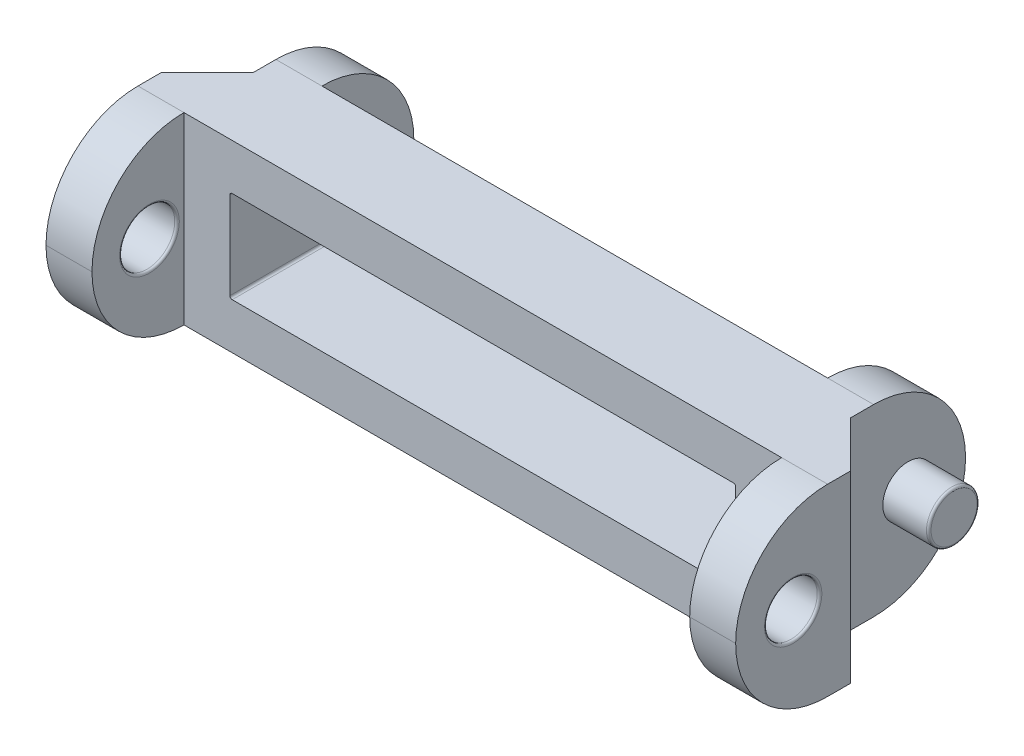
ISO-10303-21;
HEADER;
FILE_DESCRIPTION(('STEP AP214'),'2;1');
FILE_NAME('part.step','',(''),(''),'','','');
FILE_SCHEMA(('AUTOMOTIVE_DESIGN { 1 0 10303 214 1 1 1 1 }'));
ENDSEC;
DATA;
#1=APPLICATION_CONTEXT('core data for automotive mechanical design processes');
#2=APPLICATION_PROTOCOL_DEFINITION('international standard','automotive_design',2000,#1);
#3=PRODUCT_CONTEXT('',#1,'mechanical');
#4=PRODUCT('Part','Part','',(#3));
#5=PRODUCT_RELATED_PRODUCT_CATEGORY('part','',(#4));
#6=PRODUCT_DEFINITION_FORMATION('','',#4);
#7=PRODUCT_DEFINITION_CONTEXT('part definition',#1,'design');
#8=PRODUCT_DEFINITION('design','',#6,#7);
#9=PRODUCT_DEFINITION_SHAPE('','',#8);
#10=(LENGTH_UNIT() NAMED_UNIT(*) SI_UNIT(.MILLI.,.METRE.));
#11=(NAMED_UNIT(*) PLANE_ANGLE_UNIT() SI_UNIT($,.RADIAN.));
#12=(NAMED_UNIT(*) SI_UNIT($,.STERADIAN.) SOLID_ANGLE_UNIT());
#13=UNCERTAINTY_MEASURE_WITH_UNIT(LENGTH_MEASURE(1.E-05),#10,'distance_accuracy_value','');
#14=(GEOMETRIC_REPRESENTATION_CONTEXT(3) GLOBAL_UNCERTAINTY_ASSIGNED_CONTEXT((#13)) GLOBAL_UNIT_ASSIGNED_CONTEXT((#10,
#11,#12)) REPRESENTATION_CONTEXT('',''));
#15=CARTESIAN_POINT('',(0.,0.,0.));
#16=DIRECTION('',(0.,0.,1.));
#17=DIRECTION('',(1.,0.,0.));
#18=AXIS2_PLACEMENT_3D('',#15,#16,#17);
#19=CARTESIAN_POINT('',(0.,0.,-1.));
#20=DIRECTION('',(0.,0.,1.));
#21=DIRECTION('',(1.,0.,0.));
#22=AXIS2_PLACEMENT_3D('',#19,#20,#21);
#23=PLANE('',#22);
#24=DIRECTION('',(1.,0.,0.));
#25=VECTOR('',#24,1.);
#26=CARTESIAN_POINT('',(0.,-2.,-1.));
#27=LINE('',#26,#25);
#28=CARTESIAN_POINT('',(-5.5,-2.,-1.));
#29=VERTEX_POINT('',#28);
#30=CARTESIAN_POINT('',(5.5,-2.,-1.));
#31=VERTEX_POINT('',#30);
#32=EDGE_CURVE('E255',#29,#31,#27,.T.);
#33=ORIENTED_EDGE('',*,*,#32,.F.);
#34=DIRECTION('',(0.,1.,0.));
#35=VECTOR('',#34,1.);
#36=CARTESIAN_POINT('',(-5.5,2.,-1.));
#37=LINE('',#36,#35);
#38=CARTESIAN_POINT('',(-5.5,-0.95,-1.));
#39=VERTEX_POINT('',#38);
#40=EDGE_CURVE('E285',#29,#39,#37,.T.);
#41=ORIENTED_EDGE('',*,*,#40,.T.);
#42=CARTESIAN_POINT('',(-5.45,-0.95,-1.));
#43=DIRECTION('',(0.,0.,1.));
#44=DIRECTION('',(1.,0.,0.));
#45=AXIS2_PLACEMENT_3D('',#42,#43,#44);
#46=CIRCLE('',#45,0.05);
#47=CARTESIAN_POINT('',(-5.45,-1.,-1.));
#48=VERTEX_POINT('',#47);
#49=EDGE_CURVE('E74',#39,#48,#46,.T.);
#50=ORIENTED_EDGE('',*,*,#49,.T.);
#51=DIRECTION('',(1.,0.,0.));
#52=VECTOR('',#51,1.);
#53=CARTESIAN_POINT('',(-5.5,-1.,-1.));
#54=LINE('',#53,#52);
#55=CARTESIAN_POINT('',(5.45,-1.,-1.));
#56=VERTEX_POINT('',#55);
#57=EDGE_CURVE('E526',#48,#56,#54,.T.);
#58=ORIENTED_EDGE('',*,*,#57,.T.);
#59=CARTESIAN_POINT('',(5.45,-0.95,-1.));
#60=DIRECTION('',(0.,0.,1.));
#61=DIRECTION('',(1.,0.,0.));
#62=AXIS2_PLACEMENT_3D('',#59,#60,#61);
#63=CIRCLE('',#62,0.05);
#64=CARTESIAN_POINT('',(5.5,-0.95,-1.));
#65=VERTEX_POINT('',#64);
#66=EDGE_CURVE('E329',#56,#65,#63,.T.);
#67=ORIENTED_EDGE('',*,*,#66,.T.);
#68=DIRECTION('',(0.,-1.,0.));
#69=VECTOR('',#68,1.);
#70=CARTESIAN_POINT('',(5.5,2.,-1.));
#71=LINE('',#70,#69);
#72=EDGE_CURVE('E250',#65,#31,#71,.T.);
#73=ORIENTED_EDGE('',*,*,#72,.T.);
#74=EDGE_LOOP('',(#33,#41,#50,#58,#67,#73));
#75=FACE_BOUND('',#74,.T.);
#76=ADVANCED_FACE('F59',(#75),#23,.F.);
#77=CARTESIAN_POINT('',(6.5,0.,1.));
#78=DIRECTION('',(-1.,0.,0.));
#79=DIRECTION('',(0.,0.,1.));
#80=AXIS2_PLACEMENT_3D('',#77,#78,#79);
#81=PLANE('',#80);
#82=CARTESIAN_POINT('',(6.5,0.,-1.75));
#83=DIRECTION('',(-1.,0.,0.));
#84=DIRECTION('',(0.,0.,1.));
#85=AXIS2_PLACEMENT_3D('',#82,#83,#84);
#86=CIRCLE('',#85,0.55);
#87=CARTESIAN_POINT('',(6.5,0.,-1.2));
#88=VERTEX_POINT('',#87);
#89=EDGE_CURVE('E305',#88,#88,#86,.F.);
#90=ORIENTED_EDGE('',*,*,#89,.F.);
#91=EDGE_LOOP('',(#90));
#92=FACE_BOUND('',#91,.T.);
#93=DIRECTION('',(0.,0.,-1.));
#94=VECTOR('',#93,1.);
#95=CARTESIAN_POINT('',(6.5,-2.,1.));
#96=LINE('',#95,#94);
#97=CARTESIAN_POINT('',(6.5,-2.,-0.499999999999996));
#98=VERTEX_POINT('',#97);
#99=CARTESIAN_POINT('',(6.5,-2.,-1.));
#100=VERTEX_POINT('',#99);
#101=EDGE_CURVE('E544',#98,#100,#96,.T.);
#102=ORIENTED_EDGE('',*,*,#101,.T.);
#103=CARTESIAN_POINT('',(6.5,0.,-1.));
#104=DIRECTION('',(-1.,0.,0.));
#105=DIRECTION('',(0.,0.,1.));
#106=AXIS2_PLACEMENT_3D('',#103,#104,#105);
#107=CIRCLE('',#106,2.);
#108=CARTESIAN_POINT('',(6.5,0.,-3.));
#109=VERTEX_POINT('',#108);
#110=EDGE_CURVE('E261',#100,#109,#107,.F.);
#111=ORIENTED_EDGE('',*,*,#110,.T.);
#112=CARTESIAN_POINT('',(6.5,0.,-1.));
#113=DIRECTION('',(-1.,0.,0.));
#114=DIRECTION('',(0.,0.,1.));
#115=AXIS2_PLACEMENT_3D('',#112,#113,#114);
#116=CIRCLE('',#115,2.);
#117=CARTESIAN_POINT('',(6.5,2.,-1.));
#118=VERTEX_POINT('',#117);
#119=EDGE_CURVE('E264',#109,#118,#116,.F.);
#120=ORIENTED_EDGE('',*,*,#119,.T.);
#121=DIRECTION('',(0.,0.,-1.));
#122=VECTOR('',#121,1.);
#123=CARTESIAN_POINT('',(6.5,2.,1.));
#124=LINE('',#123,#122);
#125=CARTESIAN_POINT('',(6.5,2.,-0.499999999999995));
#126=VERTEX_POINT('',#125);
#127=EDGE_CURVE('E228',#126,#118,#124,.T.);
#128=ORIENTED_EDGE('',*,*,#127,.F.);
#129=DIRECTION('',(0.,-1.,0.));
#130=VECTOR('',#129,1.);
#131=CARTESIAN_POINT('',(6.5,-2.,-0.499999999999996));
#132=LINE('',#131,#130);
#133=EDGE_CURVE('E564',#126,#98,#132,.T.);
#134=ORIENTED_EDGE('',*,*,#133,.T.);
#135=EDGE_LOOP('',(#102,#111,#120,#128,#134));
#136=FACE_BOUND('',#135,.T.);
#137=ADVANCED_FACE('F391',(#92,#136),#81,.F.);
#138=CARTESIAN_POINT('',(0.,0.,1.));
#139=DIRECTION('',(0.,0.,1.));
#140=DIRECTION('',(1.,0.,0.));
#141=AXIS2_PLACEMENT_3D('',#138,#139,#140);
#142=PLANE('',#141);
#143=DIRECTION('',(0.,1.,0.));
#144=VECTOR('',#143,1.);
#145=CARTESIAN_POINT('',(6.5,0.,1.));
#146=LINE('',#145,#144);
#147=CARTESIAN_POINT('',(6.5,-2.,1.));
#148=VERTEX_POINT('',#147);
#149=CARTESIAN_POINT('',(6.5,2.,1.));
#150=VERTEX_POINT('',#149);
#151=EDGE_CURVE('E499',#148,#150,#146,.T.);
#152=ORIENTED_EDGE('',*,*,#151,.T.);
#153=DIRECTION('',(-1.,0.,0.));
#154=VECTOR('',#153,1.);
#155=CARTESIAN_POINT('',(0.,2.,1.));
#156=LINE('',#155,#154);
#157=CARTESIAN_POINT('',(-6.5,2.,1.));
#158=VERTEX_POINT('',#157);
#159=EDGE_CURVE('E536',#150,#158,#156,.T.);
#160=ORIENTED_EDGE('',*,*,#159,.T.);
#161=DIRECTION('',(0.,-1.,0.));
#162=VECTOR('',#161,1.);
#163=CARTESIAN_POINT('',(-6.5,0.,1.));
#164=LINE('',#163,#162);
#165=CARTESIAN_POINT('',(-6.5,-2.,1.));
#166=VERTEX_POINT('',#165);
#167=EDGE_CURVE('E539',#158,#166,#164,.T.);
#168=ORIENTED_EDGE('',*,*,#167,.T.);
#169=DIRECTION('',(1.,0.,0.));
#170=VECTOR('',#169,1.);
#171=CARTESIAN_POINT('',(0.,-2.,1.));
#172=LINE('',#171,#170);
#173=EDGE_CURVE('E542',#166,#148,#172,.T.);
#174=ORIENTED_EDGE('',*,*,#173,.T.);
#175=EDGE_LOOP('',(#152,#160,#168,#174));
#176=FACE_BOUND('',#175,.T.);
#177=DIRECTION('',(-1.,0.,0.));
#178=VECTOR('',#177,1.);
#179=CARTESIAN_POINT('',(-5.5,1.,1.));
#180=LINE('',#179,#178);
#181=CARTESIAN_POINT('',(5.45,1.,1.));
#182=VERTEX_POINT('',#181);
#183=CARTESIAN_POINT('',(-5.45,1.,1.));
#184=VERTEX_POINT('',#183);
#185=EDGE_CURVE('E525',#182,#184,#180,.T.);
#186=ORIENTED_EDGE('',*,*,#185,.F.);
#187=CARTESIAN_POINT('',(5.45,0.95,1.));
#188=DIRECTION('',(0.,0.,1.));
#189=DIRECTION('',(1.,0.,0.));
#190=AXIS2_PLACEMENT_3D('',#187,#188,#189);
#191=CIRCLE('',#190,0.05);
#192=CARTESIAN_POINT('',(5.5,0.95,1.));
#193=VERTEX_POINT('',#192);
#194=EDGE_CURVE('E327',#182,#193,#191,.F.);
#195=ORIENTED_EDGE('',*,*,#194,.T.);
#196=DIRECTION('',(0.,1.,0.));
#197=VECTOR('',#196,1.);
#198=CARTESIAN_POINT('',(5.5,-1.,1.));
#199=LINE('',#198,#197);
#200=CARTESIAN_POINT('',(5.5,-0.95,1.));
#201=VERTEX_POINT('',#200);
#202=EDGE_CURVE('E523',#201,#193,#199,.T.);
#203=ORIENTED_EDGE('',*,*,#202,.F.);
#204=CARTESIAN_POINT('',(5.45,-0.95,1.));
#205=DIRECTION('',(0.,0.,1.));
#206=DIRECTION('',(1.,0.,0.));
#207=AXIS2_PLACEMENT_3D('',#204,#205,#206);
#208=CIRCLE('',#207,0.05);
#209=CARTESIAN_POINT('',(5.45,-1.,1.));
#210=VERTEX_POINT('',#209);
#211=EDGE_CURVE('E332',#201,#210,#208,.F.);
#212=ORIENTED_EDGE('',*,*,#211,.T.);
#213=DIRECTION('',(1.,0.,0.));
#214=VECTOR('',#213,1.);
#215=CARTESIAN_POINT('',(-5.5,-1.,1.));
#216=LINE('',#215,#214);
#217=CARTESIAN_POINT('',(-5.45,-1.,1.));
#218=VERTEX_POINT('',#217);
#219=EDGE_CURVE('E256',#218,#210,#216,.T.);
#220=ORIENTED_EDGE('',*,*,#219,.F.);
#221=CARTESIAN_POINT('',(-5.45,-0.95,1.));
#222=DIRECTION('',(0.,0.,1.));
#223=DIRECTION('',(1.,0.,0.));
#224=AXIS2_PLACEMENT_3D('',#221,#222,#223);
#225=CIRCLE('',#224,0.05);
#226=CARTESIAN_POINT('',(-5.5,-0.95,1.));
#227=VERTEX_POINT('',#226);
#228=EDGE_CURVE('E349',#218,#227,#225,.F.);
#229=ORIENTED_EDGE('',*,*,#228,.T.);
#230=DIRECTION('',(0.,-1.,0.));
#231=VECTOR('',#230,1.);
#232=CARTESIAN_POINT('',(-5.5,-1.,1.));
#233=LINE('',#232,#231);
#234=CARTESIAN_POINT('',(-5.5,0.95,1.));
#235=VERTEX_POINT('',#234);
#236=EDGE_CURVE('E529',#235,#227,#233,.T.);
#237=ORIENTED_EDGE('',*,*,#236,.F.);
#238=CARTESIAN_POINT('',(-5.45,0.95,1.));
#239=DIRECTION('',(0.,0.,1.));
#240=DIRECTION('',(1.,0.,0.));
#241=AXIS2_PLACEMENT_3D('',#238,#239,#240);
#242=CIRCLE('',#241,0.05);
#243=EDGE_CURVE('E346',#235,#184,#242,.F.);
#244=ORIENTED_EDGE('',*,*,#243,.T.);
#245=EDGE_LOOP('',(#186,#195,#203,#212,#220,#229,#237,#244));
#246=FACE_BOUND('',#245,.T.);
#247=ADVANCED_FACE('F396',(#176,#246),#142,.T.);
#248=CARTESIAN_POINT('',(5.5,2.,-1.));
#249=VERTEX_POINT('',#248);
#250=CARTESIAN_POINT('',(5.5,0.95,-1.));
#251=VERTEX_POINT('',#250);
#252=EDGE_CURVE('E237',#249,#251,#71,.T.);
#253=ORIENTED_EDGE('',*,*,#252,.T.);
#254=CARTESIAN_POINT('',(5.45,0.95,-1.));
#255=DIRECTION('',(0.,0.,1.));
#256=DIRECTION('',(1.,0.,0.));
#257=AXIS2_PLACEMENT_3D('',#254,#255,#256);
#258=CIRCLE('',#257,0.05);
#259=CARTESIAN_POINT('',(5.45,1.,-1.));
#260=VERTEX_POINT('',#259);
#261=EDGE_CURVE('E325',#251,#260,#258,.T.);
#262=ORIENTED_EDGE('',*,*,#261,.T.);
#263=DIRECTION('',(-1.,0.,0.));
#264=VECTOR('',#263,1.);
#265=CARTESIAN_POINT('',(-5.5,1.,-1.));
#266=LINE('',#265,#264);
#267=CARTESIAN_POINT('',(-5.45,1.,-1.));
#268=VERTEX_POINT('',#267);
#269=EDGE_CURVE('E522',#260,#268,#266,.T.);
#270=ORIENTED_EDGE('',*,*,#269,.T.);
#271=CARTESIAN_POINT('',(-5.45,0.95,-1.));
#272=DIRECTION('',(0.,0.,1.));
#273=DIRECTION('',(1.,0.,0.));
#274=AXIS2_PLACEMENT_3D('',#271,#272,#273);
#275=CIRCLE('',#274,0.05);
#276=CARTESIAN_POINT('',(-5.5,0.95,-1.));
#277=VERTEX_POINT('',#276);
#278=EDGE_CURVE('E344',#268,#277,#275,.T.);
#279=ORIENTED_EDGE('',*,*,#278,.T.);
#280=CARTESIAN_POINT('',(-5.5,2.,-1.));
#281=VERTEX_POINT('',#280);
#282=EDGE_CURVE('E254',#277,#281,#37,.T.);
#283=ORIENTED_EDGE('',*,*,#282,.T.);
#284=DIRECTION('',(-1.,0.,0.));
#285=VECTOR('',#284,1.);
#286=CARTESIAN_POINT('',(0.,2.,-1.));
#287=LINE('',#286,#285);
#288=EDGE_CURVE('E225',#249,#281,#287,.T.);
#289=ORIENTED_EDGE('',*,*,#288,.F.);
#290=EDGE_LOOP('',(#253,#262,#270,#279,#283,#289));
#291=FACE_BOUND('',#290,.T.);
#292=ADVANCED_FACE('F252',(#291),#23,.F.);
#293=CARTESIAN_POINT('',(0.,2.,1.));
#294=DIRECTION('',(0.,-1.,0.));
#295=DIRECTION('',(0.,0.,-1.));
#296=AXIS2_PLACEMENT_3D('',#293,#294,#295);
#297=PLANE('',#296);
#298=ORIENTED_EDGE('',*,*,#288,.T.);
#299=DIRECTION('',(-1.,0.,0.));
#300=VECTOR('',#299,1.);
#301=CARTESIAN_POINT('',(-6.5,2.,-1.));
#302=LINE('',#301,#300);
#303=CARTESIAN_POINT('',(-6.5,2.,-1.));
#304=VERTEX_POINT('',#303);
#305=EDGE_CURVE('E303',#281,#304,#302,.T.);
#306=ORIENTED_EDGE('',*,*,#305,.T.);
#307=DIRECTION('',(0.,0.,-1.));
#308=VECTOR('',#307,1.);
#309=CARTESIAN_POINT('',(-6.5,2.,1.));
#310=LINE('',#309,#308);
#311=CARTESIAN_POINT('',(-6.5,2.,-0.500000000000002));
#312=VERTEX_POINT('',#311);
#313=EDGE_CURVE('E487',#312,#304,#310,.T.);
#314=ORIENTED_EDGE('',*,*,#313,.F.);
#315=DIRECTION('',(-0.707106781186545,0.,0.70710678118655));
#316=VECTOR('',#315,1.);
#317=CARTESIAN_POINT('',(-4.00000000000003,2.,-3.));
#318=LINE('',#317,#316);
#319=CARTESIAN_POINT('',(-7.5,2.,0.5));
#320=VERTEX_POINT('',#319);
#321=EDGE_CURVE('E288',#312,#320,#318,.T.);
#322=ORIENTED_EDGE('',*,*,#321,.T.);
#323=DIRECTION('',(0.,0.,1.));
#324=VECTOR('',#323,1.);
#325=CARTESIAN_POINT('',(-7.5,2.,0.5));
#326=LINE('',#325,#324);
#327=CARTESIAN_POINT('',(-7.5,2.,1.));
#328=VERTEX_POINT('',#327);
#329=EDGE_CURVE('E509',#320,#328,#326,.T.);
#330=ORIENTED_EDGE('',*,*,#329,.T.);
#331=DIRECTION('',(1.,0.,0.));
#332=VECTOR('',#331,1.);
#333=CARTESIAN_POINT('',(-6.5,2.,1.));
#334=LINE('',#333,#332);
#335=EDGE_CURVE('E280',#328,#158,#334,.T.);
#336=ORIENTED_EDGE('',*,*,#335,.T.);
#337=ORIENTED_EDGE('',*,*,#159,.F.);
#338=DIRECTION('',(-1.,0.,0.));
#339=VECTOR('',#338,1.);
#340=CARTESIAN_POINT('',(0.,2.,1.));
#341=LINE('',#340,#339);
#342=CARTESIAN_POINT('',(7.5,2.,1.));
#343=VERTEX_POINT('',#342);
#344=EDGE_CURVE('E562',#150,#343,#341,.F.);
#345=ORIENTED_EDGE('',*,*,#344,.T.);
#346=DIRECTION('',(0.,0.,1.));
#347=VECTOR('',#346,1.);
#348=CARTESIAN_POINT('',(7.5,2.,0.5));
#349=LINE('',#348,#347);
#350=CARTESIAN_POINT('',(7.5,2.,0.5));
#351=VERTEX_POINT('',#350);
#352=EDGE_CURVE('E516',#351,#343,#349,.T.);
#353=ORIENTED_EDGE('',*,*,#352,.F.);
#354=DIRECTION('',(0.707106781186549,0.,0.707106781186546));
#355=VECTOR('',#354,1.);
#356=CARTESIAN_POINT('',(3.99999999999998,2.,-3.));
#357=LINE('',#356,#355);
#358=EDGE_CURVE('E568',#351,#126,#357,.F.);
#359=ORIENTED_EDGE('',*,*,#358,.T.);
#360=ORIENTED_EDGE('',*,*,#127,.T.);
#361=DIRECTION('',(1.,0.,0.));
#362=VECTOR('',#361,1.);
#363=CARTESIAN_POINT('',(5.5,2.,-1.));
#364=LINE('',#363,#362);
#365=EDGE_CURVE('E221',#118,#249,#364,.F.);
#366=ORIENTED_EDGE('',*,*,#365,.T.);
#367=EDGE_LOOP('',(#298,#306,#314,#322,#330,#336,#337,#345,#353,#359,#360,#366));
#368=FACE_BOUND('',#367,.T.);
#369=ADVANCED_FACE('F223',(#368),#297,.F.);
#370=CARTESIAN_POINT('',(-6.5,0.,1.));
#371=DIRECTION('',(1.,0.,0.));
#372=DIRECTION('',(0.,0.,-1.));
#373=AXIS2_PLACEMENT_3D('',#370,#371,#372);
#374=PLANE('',#373);
#375=CARTESIAN_POINT('',(-6.5,0.,-1.75));
#376=DIRECTION('',(1.,0.,0.));
#377=DIRECTION('',(0.,0.,-1.));
#378=AXIS2_PLACEMENT_3D('',#375,#376,#377);
#379=CIRCLE('',#378,0.55);
#380=CARTESIAN_POINT('',(-6.5,0.,-2.3));
#381=VERTEX_POINT('',#380);
#382=EDGE_CURVE('E375',#381,#381,#379,.F.);
#383=ORIENTED_EDGE('',*,*,#382,.F.);
#384=EDGE_LOOP('',(#383));
#385=FACE_BOUND('',#384,.T.);
#386=CARTESIAN_POINT('',(-6.5,0.,-1.));
#387=DIRECTION('',(1.,0.,0.));
#388=DIRECTION('',(0.,0.,-1.));
#389=AXIS2_PLACEMENT_3D('',#386,#387,#388);
#390=CIRCLE('',#389,2.);
#391=CARTESIAN_POINT('',(-6.5,0.,-3.));
#392=VERTEX_POINT('',#391);
#393=EDGE_CURVE('E292',#304,#392,#390,.F.);
#394=ORIENTED_EDGE('',*,*,#393,.T.);
#395=CARTESIAN_POINT('',(-6.5,0.,-1.));
#396=DIRECTION('',(1.,0.,0.));
#397=DIRECTION('',(0.,0.,-1.));
#398=AXIS2_PLACEMENT_3D('',#395,#396,#397);
#399=CIRCLE('',#398,2.);
#400=CARTESIAN_POINT('',(-6.5,-2.,-1.));
#401=VERTEX_POINT('',#400);
#402=EDGE_CURVE('E294',#392,#401,#399,.F.);
#403=ORIENTED_EDGE('',*,*,#402,.T.);
#404=DIRECTION('',(0.,0.,-1.));
#405=VECTOR('',#404,1.);
#406=CARTESIAN_POINT('',(-6.5,-2.,1.));
#407=LINE('',#406,#405);
#408=CARTESIAN_POINT('',(-6.5,-2.,-0.500000000000003));
#409=VERTEX_POINT('',#408);
#410=EDGE_CURVE('E495',#409,#401,#407,.T.);
#411=ORIENTED_EDGE('',*,*,#410,.F.);
#412=DIRECTION('',(0.,1.,0.));
#413=VECTOR('',#412,1.);
#414=CARTESIAN_POINT('',(-6.5,0.,-0.500000000000003));
#415=LINE('',#414,#413);
#416=EDGE_CURVE('E282',#409,#312,#415,.T.);
#417=ORIENTED_EDGE('',*,*,#416,.T.);
#418=ORIENTED_EDGE('',*,*,#313,.T.);
#419=EDGE_LOOP('',(#394,#403,#411,#417,#418));
#420=FACE_BOUND('',#419,.T.);
#421=ADVANCED_FACE('F407',(#385,#420),#374,.F.);
#422=CARTESIAN_POINT('',(0.,-2.,1.));
#423=DIRECTION('',(0.,1.,0.));
#424=DIRECTION('',(0.,0.,1.));
#425=AXIS2_PLACEMENT_3D('',#422,#423,#424);
#426=PLANE('',#425);
#427=ORIENTED_EDGE('',*,*,#410,.T.);
#428=DIRECTION('',(-1.,0.,0.));
#429=VECTOR('',#428,1.);
#430=CARTESIAN_POINT('',(-5.5,-2.,-1.));
#431=LINE('',#430,#429);
#432=EDGE_CURVE('E296',#401,#29,#431,.F.);
#433=ORIENTED_EDGE('',*,*,#432,.T.);
#434=ORIENTED_EDGE('',*,*,#32,.T.);
#435=DIRECTION('',(1.,0.,0.));
#436=VECTOR('',#435,1.);
#437=CARTESIAN_POINT('',(6.5,-2.,-1.));
#438=LINE('',#437,#436);
#439=EDGE_CURVE('E572',#31,#100,#438,.T.);
#440=ORIENTED_EDGE('',*,*,#439,.T.);
#441=ORIENTED_EDGE('',*,*,#101,.F.);
#442=DIRECTION('',(-0.707106781186549,0.,-0.707106781186546));
#443=VECTOR('',#442,1.);
#444=CARTESIAN_POINT('',(3.99999999999998,-2.,-3.));
#445=LINE('',#444,#443);
#446=CARTESIAN_POINT('',(7.5,-2.,0.5));
#447=VERTEX_POINT('',#446);
#448=EDGE_CURVE('E570',#98,#447,#445,.F.);
#449=ORIENTED_EDGE('',*,*,#448,.T.);
#450=DIRECTION('',(0.,0.,-1.));
#451=VECTOR('',#450,1.);
#452=CARTESIAN_POINT('',(7.5,-2.,0.5));
#453=LINE('',#452,#451);
#454=CARTESIAN_POINT('',(7.5,-2.,1.));
#455=VERTEX_POINT('',#454);
#456=EDGE_CURVE('E519',#455,#447,#453,.T.);
#457=ORIENTED_EDGE('',*,*,#456,.F.);
#458=DIRECTION('',(-1.,0.,0.));
#459=VECTOR('',#458,1.);
#460=CARTESIAN_POINT('',(0.,-2.,1.));
#461=LINE('',#460,#459);
#462=EDGE_CURVE('E551',#455,#148,#461,.T.);
#463=ORIENTED_EDGE('',*,*,#462,.T.);
#464=ORIENTED_EDGE('',*,*,#173,.F.);
#465=DIRECTION('',(1.,0.,0.));
#466=VECTOR('',#465,1.);
#467=CARTESIAN_POINT('',(-7.5,-2.,1.));
#468=LINE('',#467,#466);
#469=CARTESIAN_POINT('',(-7.5,-2.,1.));
#470=VERTEX_POINT('',#469);
#471=EDGE_CURVE('E273',#166,#470,#468,.F.);
#472=ORIENTED_EDGE('',*,*,#471,.T.);
#473=DIRECTION('',(0.,0.,-1.));
#474=VECTOR('',#473,1.);
#475=CARTESIAN_POINT('',(-7.5,-2.,0.5));
#476=LINE('',#475,#474);
#477=CARTESIAN_POINT('',(-7.5,-2.,0.5));
#478=VERTEX_POINT('',#477);
#479=EDGE_CURVE('E507',#470,#478,#476,.T.);
#480=ORIENTED_EDGE('',*,*,#479,.T.);
#481=DIRECTION('',(0.707106781186545,0.,-0.70710678118655));
#482=VECTOR('',#481,1.);
#483=CARTESIAN_POINT('',(-4.00000000000003,-2.,-3.));
#484=LINE('',#483,#482);
#485=EDGE_CURVE('E290',#478,#409,#484,.T.);
#486=ORIENTED_EDGE('',*,*,#485,.T.);
#487=EDGE_LOOP('',(#427,#433,#434,#440,#441,#449,#457,#463,#464,#472,#480,#486));
#488=FACE_BOUND('',#487,.T.);
#489=ADVANCED_FACE('F418',(#488),#426,.F.);
#490=CARTESIAN_POINT('',(5.5,-1.,1.));
#491=DIRECTION('',(-1.,0.,0.));
#492=DIRECTION('',(0.,0.,1.));
#493=AXIS2_PLACEMENT_3D('',#490,#491,#492);
#494=PLANE('',#493);
#495=ORIENTED_EDGE('',*,*,#202,.T.);
#496=DIRECTION('',(0.,0.,-1.));
#497=VECTOR('',#496,1.);
#498=CARTESIAN_POINT('',(5.5,0.95,-1.));
#499=LINE('',#498,#497);
#500=EDGE_CURVE('E244',#193,#251,#499,.T.);
#501=ORIENTED_EDGE('',*,*,#500,.T.);
#502=ORIENTED_EDGE('',*,*,#252,.F.);
#503=CARTESIAN_POINT('',(5.5,0.,-1.));
#504=DIRECTION('',(-1.,0.,0.));
#505=DIRECTION('',(0.,0.,1.));
#506=AXIS2_PLACEMENT_3D('',#503,#504,#505);
#507=CIRCLE('',#506,2.);
#508=CARTESIAN_POINT('',(5.5,0.,-3.));
#509=VERTEX_POINT('',#508);
#510=EDGE_CURVE('E241',#249,#509,#507,.T.);
#511=ORIENTED_EDGE('',*,*,#510,.T.);
#512=CARTESIAN_POINT('',(5.5,0.,-1.));
#513=DIRECTION('',(-1.,0.,0.));
#514=DIRECTION('',(0.,0.,1.));
#515=AXIS2_PLACEMENT_3D('',#512,#513,#514);
#516=CIRCLE('',#515,2.);
#517=EDGE_CURVE('E233',#509,#31,#516,.T.);
#518=ORIENTED_EDGE('',*,*,#517,.T.);
#519=ORIENTED_EDGE('',*,*,#72,.F.);
#520=DIRECTION('',(0.,0.,-1.));
#521=VECTOR('',#520,1.);
#522=CARTESIAN_POINT('',(5.5,-0.95,1.));
#523=LINE('',#522,#521);
#524=EDGE_CURVE('E317',#65,#201,#523,.F.);
#525=ORIENTED_EDGE('',*,*,#524,.T.);
#526=EDGE_LOOP('',(#495,#501,#502,#511,#518,#519,#525));
#527=FACE_BOUND('',#526,.T.);
#528=ADVANCED_FACE('F239',(#527),#494,.T.);
#529=CARTESIAN_POINT('',(-5.5,1.,1.));
#530=DIRECTION('',(0.,-1.,0.));
#531=DIRECTION('',(0.,0.,-1.));
#532=AXIS2_PLACEMENT_3D('',#529,#530,#531);
#533=PLANE('',#532);
#534=ORIENTED_EDGE('',*,*,#185,.T.);
#535=DIRECTION('',(0.,0.,-1.));
#536=VECTOR('',#535,1.);
#537=CARTESIAN_POINT('',(-5.45,1.,-1.));
#538=LINE('',#537,#536);
#539=EDGE_CURVE('E335',#184,#268,#538,.T.);
#540=ORIENTED_EDGE('',*,*,#539,.T.);
#541=ORIENTED_EDGE('',*,*,#269,.F.);
#542=DIRECTION('',(0.,0.,-1.));
#543=VECTOR('',#542,1.);
#544=CARTESIAN_POINT('',(5.45,1.,1.));
#545=LINE('',#544,#543);
#546=EDGE_CURVE('E320',#260,#182,#545,.F.);
#547=ORIENTED_EDGE('',*,*,#546,.T.);
#548=EDGE_LOOP('',(#534,#540,#541,#547));
#549=FACE_BOUND('',#548,.T.);
#550=ADVANCED_FACE('F417',(#549),#533,.T.);
#551=CARTESIAN_POINT('',(-5.5,-1.,1.));
#552=DIRECTION('',(1.,0.,0.));
#553=DIRECTION('',(0.,0.,-1.));
#554=AXIS2_PLACEMENT_3D('',#551,#552,#553);
#555=PLANE('',#554);
#556=ORIENTED_EDGE('',*,*,#282,.F.);
#557=DIRECTION('',(0.,0.,-1.));
#558=VECTOR('',#557,1.);
#559=CARTESIAN_POINT('',(-5.5,0.95,1.));
#560=LINE('',#559,#558);
#561=EDGE_CURVE('E341',#277,#235,#560,.F.);
#562=ORIENTED_EDGE('',*,*,#561,.T.);
#563=ORIENTED_EDGE('',*,*,#236,.T.);
#564=DIRECTION('',(0.,0.,-1.));
#565=VECTOR('',#564,1.);
#566=CARTESIAN_POINT('',(-5.5,-0.95,-1.));
#567=LINE('',#566,#565);
#568=EDGE_CURVE('E338',#227,#39,#567,.T.);
#569=ORIENTED_EDGE('',*,*,#568,.T.);
#570=ORIENTED_EDGE('',*,*,#40,.F.);
#571=CARTESIAN_POINT('',(-5.5,0.,-1.));
#572=DIRECTION('',(1.,0.,0.));
#573=DIRECTION('',(0.,0.,-1.));
#574=AXIS2_PLACEMENT_3D('',#571,#572,#573);
#575=CIRCLE('',#574,2.);
#576=CARTESIAN_POINT('',(-5.5,0.,-3.));
#577=VERTEX_POINT('',#576);
#578=EDGE_CURVE('E301',#29,#577,#575,.T.);
#579=ORIENTED_EDGE('',*,*,#578,.T.);
#580=CARTESIAN_POINT('',(-5.5,0.,-1.));
#581=DIRECTION('',(1.,0.,0.));
#582=DIRECTION('',(0.,0.,-1.));
#583=AXIS2_PLACEMENT_3D('',#580,#581,#582);
#584=CIRCLE('',#583,2.);
#585=EDGE_CURVE('E299',#577,#281,#584,.T.);
#586=ORIENTED_EDGE('',*,*,#585,.T.);
#587=EDGE_LOOP('',(#556,#562,#563,#569,#570,#579,#586));
#588=FACE_BOUND('',#587,.T.);
#589=ADVANCED_FACE('F421',(#588),#555,.T.);
#590=CARTESIAN_POINT('',(-5.5,-1.,1.));
#591=DIRECTION('',(0.,1.,0.));
#592=DIRECTION('',(0.,0.,1.));
#593=AXIS2_PLACEMENT_3D('',#590,#591,#592);
#594=PLANE('',#593);
#595=ORIENTED_EDGE('',*,*,#57,.F.);
#596=DIRECTION('',(0.,0.,-1.));
#597=VECTOR('',#596,1.);
#598=CARTESIAN_POINT('',(-5.45,-1.,1.));
#599=LINE('',#598,#597);
#600=EDGE_CURVE('E81',#48,#218,#599,.F.);
#601=ORIENTED_EDGE('',*,*,#600,.T.);
#602=ORIENTED_EDGE('',*,*,#219,.T.);
#603=DIRECTION('',(0.,0.,-1.));
#604=VECTOR('',#603,1.);
#605=CARTESIAN_POINT('',(5.45,-1.,-1.));
#606=LINE('',#605,#604);
#607=EDGE_CURVE('E322',#210,#56,#606,.T.);
#608=ORIENTED_EDGE('',*,*,#607,.T.);
#609=EDGE_LOOP('',(#595,#601,#602,#608));
#610=FACE_BOUND('',#609,.T.);
#611=ADVANCED_FACE('F425',(#610),#594,.T.);
#612=CARTESIAN_POINT('',(6.5,0.,0.));
#613=DIRECTION('',(-1.,0.,0.));
#614=DIRECTION('',(0.,0.,1.));
#615=AXIS2_PLACEMENT_3D('',#612,#613,#614);
#616=PLANE('',#615);
#617=CARTESIAN_POINT('',(6.5,0.,1.75));
#618=DIRECTION('',(-1.,0.,0.));
#619=DIRECTION('',(0.,0.,1.));
#620=AXIS2_PLACEMENT_3D('',#617,#618,#619);
#621=CIRCLE('',#620,0.623833464467269);
#622=CARTESIAN_POINT('',(6.5,0.,2.37383346446727));
#623=VERTEX_POINT('',#622);
#624=EDGE_CURVE('E351',#623,#623,#621,.F.);
#625=ORIENTED_EDGE('',*,*,#624,.T.);
#626=EDGE_LOOP('',(#625));
#627=FACE_BOUND('',#626,.T.);
#628=ORIENTED_EDGE('',*,*,#151,.F.);
#629=CARTESIAN_POINT('',(6.5,0.,1.));
#630=DIRECTION('',(-1.,0.,0.));
#631=DIRECTION('',(0.,0.,1.));
#632=AXIS2_PLACEMENT_3D('',#629,#630,#631);
#633=CIRCLE('',#632,2.);
#634=CARTESIAN_POINT('',(6.5,0.,3.));
#635=VERTEX_POINT('',#634);
#636=EDGE_CURVE('E556',#148,#635,#633,.T.);
#637=ORIENTED_EDGE('',*,*,#636,.T.);
#638=CARTESIAN_POINT('',(6.5,0.,1.));
#639=DIRECTION('',(-1.,0.,0.));
#640=DIRECTION('',(0.,0.,1.));
#641=AXIS2_PLACEMENT_3D('',#638,#639,#640);
#642=CIRCLE('',#641,2.);
#643=EDGE_CURVE('E554',#635,#150,#642,.T.);
#644=ORIENTED_EDGE('',*,*,#643,.T.);
#645=EDGE_LOOP('',(#628,#637,#644));
#646=FACE_BOUND('',#645,.T.);
#647=ADVANCED_FACE('F429',(#627,#646),#616,.T.);
#648=CARTESIAN_POINT('',(7.5,0.,0.));
#649=DIRECTION('',(-1.,0.,0.));
#650=DIRECTION('',(0.,0.,1.));
#651=AXIS2_PLACEMENT_3D('',#648,#649,#650);
#652=PLANE('',#651);
#653=CARTESIAN_POINT('',(7.5,0.,1.75));
#654=DIRECTION('',(-1.,0.,0.));
#655=DIRECTION('',(0.,0.,1.));
#656=AXIS2_PLACEMENT_3D('',#653,#654,#655);
#657=CIRCLE('',#656,0.623833464467269);
#658=CARTESIAN_POINT('',(7.5,0.,2.37383346446727));
#659=VERTEX_POINT('',#658);
#660=EDGE_CURVE('E360',#659,#659,#657,.T.);
#661=ORIENTED_EDGE('',*,*,#660,.T.);
#662=EDGE_LOOP('',(#661));
#663=FACE_BOUND('',#662,.T.);
#664=CARTESIAN_POINT('',(7.5,0.,1.));
#665=DIRECTION('',(-1.,0.,0.));
#666=DIRECTION('',(0.,0.,1.));
#667=AXIS2_PLACEMENT_3D('',#664,#665,#666);
#668=CIRCLE('',#667,2.);
#669=CARTESIAN_POINT('',(7.5,0.,3.));
#670=VERTEX_POINT('',#669);
#671=EDGE_CURVE('E558',#343,#670,#668,.F.);
#672=ORIENTED_EDGE('',*,*,#671,.T.);
#673=CARTESIAN_POINT('',(7.5,0.,1.));
#674=DIRECTION('',(-1.,0.,0.));
#675=DIRECTION('',(0.,0.,1.));
#676=AXIS2_PLACEMENT_3D('',#673,#674,#675);
#677=CIRCLE('',#676,2.);
#678=EDGE_CURVE('E560',#670,#455,#677,.F.);
#679=ORIENTED_EDGE('',*,*,#678,.T.);
#680=ORIENTED_EDGE('',*,*,#456,.T.);
#681=DIRECTION('',(0.,1.,0.));
#682=VECTOR('',#681,1.);
#683=CARTESIAN_POINT('',(7.5,2.,0.5));
#684=LINE('',#683,#682);
#685=EDGE_CURVE('E513',#447,#351,#684,.T.);
#686=ORIENTED_EDGE('',*,*,#685,.T.);
#687=ORIENTED_EDGE('',*,*,#352,.T.);
#688=EDGE_LOOP('',(#672,#679,#680,#686,#687));
#689=FACE_BOUND('',#688,.T.);
#690=ADVANCED_FACE('F432',(#663,#689),#652,.F.);
#691=CARTESIAN_POINT('',(7.5,0.,1.));
#692=DIRECTION('',(-1.,0.,0.));
#693=DIRECTION('',(0.,0.,1.));
#694=AXIS2_PLACEMENT_3D('',#691,#692,#693);
#695=CYLINDRICAL_SURFACE('',#694,2.);
#696=DIRECTION('',(-1.,0.,0.));
#697=VECTOR('',#696,1.);
#698=CARTESIAN_POINT('',(7.5,0.,3.));
#699=LINE('',#698,#697);
#700=EDGE_CURVE('E512',#670,#635,#699,.T.);
#701=ORIENTED_EDGE('',*,*,#700,.F.);
#702=ORIENTED_EDGE('',*,*,#671,.F.);
#703=ORIENTED_EDGE('',*,*,#344,.F.);
#704=ORIENTED_EDGE('',*,*,#643,.F.);
#705=EDGE_LOOP('',(#701,#702,#703,#704));
#706=FACE_BOUND('',#705,.T.);
#707=ADVANCED_FACE('F436',(#706),#695,.T.);
#708=CARTESIAN_POINT('',(0.,0.,1.));
#709=DIRECTION('',(-1.,0.,0.));
#710=DIRECTION('',(0.,0.,1.));
#711=AXIS2_PLACEMENT_3D('',#708,#709,#710);
#712=CYLINDRICAL_SURFACE('',#711,2.);
#713=ORIENTED_EDGE('',*,*,#678,.F.);
#714=ORIENTED_EDGE('',*,*,#700,.T.);
#715=ORIENTED_EDGE('',*,*,#636,.F.);
#716=ORIENTED_EDGE('',*,*,#462,.F.);
#717=EDGE_LOOP('',(#713,#714,#715,#716));
#718=FACE_BOUND('',#717,.T.);
#719=ADVANCED_FACE('F660',(#718),#712,.T.);
#720=CARTESIAN_POINT('',(7.5,2.,0.5));
#721=DIRECTION('',(0.707106781186546,0.,-0.707106781186549));
#722=DIRECTION('',(0.,-1.,0.));
#723=AXIS2_PLACEMENT_3D('',#720,#721,#722);
#724=PLANE('',#723);
#725=ORIENTED_EDGE('',*,*,#448,.F.);
#726=ORIENTED_EDGE('',*,*,#133,.F.);
#727=ORIENTED_EDGE('',*,*,#358,.F.);
#728=ORIENTED_EDGE('',*,*,#685,.F.);
#729=EDGE_LOOP('',(#725,#726,#727,#728));
#730=FACE_BOUND('',#729,.T.);
#731=ADVANCED_FACE('F442',(#730),#724,.T.);
#732=CARTESIAN_POINT('',(-6.5,0.,0.));
#733=DIRECTION('',(1.,0.,0.));
#734=DIRECTION('',(0.,0.,1.));
#735=AXIS2_PLACEMENT_3D('',#732,#733,#734);
#736=PLANE('',#735);
#737=CARTESIAN_POINT('',(-6.5,0.,1.75));
#738=DIRECTION('',(1.,0.,0.));
#739=DIRECTION('',(0.,0.,-1.));
#740=AXIS2_PLACEMENT_3D('',#737,#738,#739);
#741=CIRCLE('',#740,0.65);
#742=CARTESIAN_POINT('',(-6.5,0.,1.1));
#743=VERTEX_POINT('',#742);
#744=EDGE_CURVE('E363',#743,#743,#741,.F.);
#745=ORIENTED_EDGE('',*,*,#744,.T.);
#746=EDGE_LOOP('',(#745));
#747=FACE_BOUND('',#746,.T.);
#748=CARTESIAN_POINT('',(-6.5,0.,1.));
#749=DIRECTION('',(1.,0.,0.));
#750=DIRECTION('',(0.,0.,-1.));
#751=AXIS2_PLACEMENT_3D('',#748,#749,#750);
#752=CIRCLE('',#751,2.);
#753=CARTESIAN_POINT('',(-6.5,0.,3.));
#754=VERTEX_POINT('',#753);
#755=EDGE_CURVE('E232',#158,#754,#752,.T.);
#756=ORIENTED_EDGE('',*,*,#755,.T.);
#757=CARTESIAN_POINT('',(-6.5,0.,1.));
#758=DIRECTION('',(1.,0.,0.));
#759=DIRECTION('',(0.,0.,-1.));
#760=AXIS2_PLACEMENT_3D('',#757,#758,#759);
#761=CIRCLE('',#760,2.);
#762=EDGE_CURVE('E271',#754,#166,#761,.T.);
#763=ORIENTED_EDGE('',*,*,#762,.T.);
#764=ORIENTED_EDGE('',*,*,#167,.F.);
#765=EDGE_LOOP('',(#756,#763,#764));
#766=FACE_BOUND('',#765,.T.);
#767=ADVANCED_FACE('F438',(#747,#766),#736,.T.);
#768=CARTESIAN_POINT('',(-7.5,0.,0.));
#769=DIRECTION('',(1.,0.,0.));
#770=DIRECTION('',(0.,0.,1.));
#771=AXIS2_PLACEMENT_3D('',#768,#769,#770);
#772=PLANE('',#771);
#773=CARTESIAN_POINT('',(-7.5,0.,1.75));
#774=DIRECTION('',(1.,0.,0.));
#775=DIRECTION('',(0.,0.,-1.));
#776=AXIS2_PLACEMENT_3D('',#773,#774,#775);
#777=CIRCLE('',#776,0.65);
#778=CARTESIAN_POINT('',(-7.5,0.,1.1));
#779=VERTEX_POINT('',#778);
#780=EDGE_CURVE('E372',#779,#779,#777,.T.);
#781=ORIENTED_EDGE('',*,*,#780,.T.);
#782=EDGE_LOOP('',(#781));
#783=FACE_BOUND('',#782,.T.);
#784=ORIENTED_EDGE('',*,*,#479,.F.);
#785=CARTESIAN_POINT('',(-7.5,0.,1.));
#786=DIRECTION('',(1.,0.,0.));
#787=DIRECTION('',(0.,0.,-1.));
#788=AXIS2_PLACEMENT_3D('',#785,#786,#787);
#789=CIRCLE('',#788,2.);
#790=CARTESIAN_POINT('',(-7.5,0.,3.));
#791=VERTEX_POINT('',#790);
#792=EDGE_CURVE('E278',#470,#791,#789,.F.);
#793=ORIENTED_EDGE('',*,*,#792,.T.);
#794=CARTESIAN_POINT('',(-7.5,0.,1.));
#795=DIRECTION('',(1.,0.,0.));
#796=DIRECTION('',(0.,0.,-1.));
#797=AXIS2_PLACEMENT_3D('',#794,#795,#796);
#798=CIRCLE('',#797,2.);
#799=EDGE_CURVE('E276',#791,#328,#798,.F.);
#800=ORIENTED_EDGE('',*,*,#799,.T.);
#801=ORIENTED_EDGE('',*,*,#329,.F.);
#802=DIRECTION('',(0.,1.,0.));
#803=VECTOR('',#802,1.);
#804=CARTESIAN_POINT('',(-7.5,2.,0.5));
#805=LINE('',#804,#803);
#806=EDGE_CURVE('E247',#478,#320,#805,.T.);
#807=ORIENTED_EDGE('',*,*,#806,.F.);
#808=EDGE_LOOP('',(#784,#793,#800,#801,#807));
#809=FACE_BOUND('',#808,.T.);
#810=ADVANCED_FACE('F441',(#783,#809),#772,.F.);
#811=CARTESIAN_POINT('',(1.02786404500042,0.,-1.));
#812=DIRECTION('',(-1.,0.,0.));
#813=DIRECTION('',(0.,0.,1.));
#814=AXIS2_PLACEMENT_3D('',#811,#812,#813);
#815=CYLINDRICAL_SURFACE('',#814,2.);
#816=DIRECTION('',(1.,0.,0.));
#817=VECTOR('',#816,1.);
#818=CARTESIAN_POINT('',(6.5,0.,-3.));
#819=LINE('',#818,#817);
#820=EDGE_CURVE('E248',#509,#109,#819,.T.);
#821=ORIENTED_EDGE('',*,*,#820,.F.);
#822=ORIENTED_EDGE('',*,*,#510,.F.);
#823=ORIENTED_EDGE('',*,*,#365,.F.);
#824=ORIENTED_EDGE('',*,*,#119,.F.);
#825=EDGE_LOOP('',(#821,#822,#823,#824));
#826=FACE_BOUND('',#825,.T.);
#827=ADVANCED_FACE('F258',(#826),#815,.T.);
#828=CARTESIAN_POINT('',(0.,0.,-1.));
#829=DIRECTION('',(-1.,0.,0.));
#830=DIRECTION('',(0.,0.,1.));
#831=AXIS2_PLACEMENT_3D('',#828,#829,#830);
#832=CYLINDRICAL_SURFACE('',#831,2.);
#833=ORIENTED_EDGE('',*,*,#517,.F.);
#834=ORIENTED_EDGE('',*,*,#820,.T.);
#835=ORIENTED_EDGE('',*,*,#110,.F.);
#836=ORIENTED_EDGE('',*,*,#439,.F.);
#837=EDGE_LOOP('',(#833,#834,#835,#836));
#838=FACE_BOUND('',#837,.T.);
#839=ADVANCED_FACE('F576',(#838),#832,.T.);
#840=CARTESIAN_POINT('',(0.,0.,1.));
#841=DIRECTION('',(-1.,0.,0.));
#842=DIRECTION('',(0.,0.,1.));
#843=AXIS2_PLACEMENT_3D('',#840,#841,#842);
#844=CYLINDRICAL_SURFACE('',#843,2.);
#845=ORIENTED_EDGE('',*,*,#335,.F.);
#846=ORIENTED_EDGE('',*,*,#799,.F.);
#847=DIRECTION('',(1.,0.,0.));
#848=VECTOR('',#847,1.);
#849=CARTESIAN_POINT('',(-7.5,0.,3.));
#850=LINE('',#849,#848);
#851=EDGE_CURVE('E269',#754,#791,#850,.F.);
#852=ORIENTED_EDGE('',*,*,#851,.F.);
#853=ORIENTED_EDGE('',*,*,#755,.F.);
#854=EDGE_LOOP('',(#845,#846,#852,#853));
#855=FACE_BOUND('',#854,.T.);
#856=ADVANCED_FACE('F629',(#855),#844,.T.);
#857=CARTESIAN_POINT('',(-7.5,0.,1.));
#858=DIRECTION('',(-1.,0.,0.));
#859=DIRECTION('',(0.,0.,1.));
#860=AXIS2_PLACEMENT_3D('',#857,#858,#859);
#861=CYLINDRICAL_SURFACE('',#860,2.);
#862=ORIENTED_EDGE('',*,*,#792,.F.);
#863=ORIENTED_EDGE('',*,*,#471,.F.);
#864=ORIENTED_EDGE('',*,*,#762,.F.);
#865=ORIENTED_EDGE('',*,*,#851,.T.);
#866=EDGE_LOOP('',(#862,#863,#864,#865));
#867=FACE_BOUND('',#866,.T.);
#868=ADVANCED_FACE('F632',(#867),#861,.T.);
#869=CARTESIAN_POINT('',(-6.5,0.,-0.500000000000003));
#870=DIRECTION('',(0.70710678118655,0.,0.707106781186545));
#871=DIRECTION('',(0.,1.,0.));
#872=AXIS2_PLACEMENT_3D('',#869,#870,#871);
#873=PLANE('',#872);
#874=ORIENTED_EDGE('',*,*,#485,.F.);
#875=ORIENTED_EDGE('',*,*,#806,.T.);
#876=ORIENTED_EDGE('',*,*,#321,.F.);
#877=ORIENTED_EDGE('',*,*,#416,.F.);
#878=EDGE_LOOP('',(#874,#875,#876,#877));
#879=FACE_BOUND('',#878,.T.);
#880=ADVANCED_FACE('F641',(#879),#873,.F.);
#881=CARTESIAN_POINT('',(0.,0.,-1.));
#882=DIRECTION('',(1.,0.,0.));
#883=DIRECTION('',(0.,0.,-1.));
#884=AXIS2_PLACEMENT_3D('',#881,#882,#883);
#885=CYLINDRICAL_SURFACE('',#884,2.);
#886=ORIENTED_EDGE('',*,*,#305,.F.);
#887=ORIENTED_EDGE('',*,*,#585,.F.);
#888=DIRECTION('',(-1.,0.,0.));
#889=VECTOR('',#888,1.);
#890=CARTESIAN_POINT('',(-5.5,0.,-3.));
#891=LINE('',#890,#889);
#892=EDGE_CURVE('E306',#392,#577,#891,.F.);
#893=ORIENTED_EDGE('',*,*,#892,.F.);
#894=ORIENTED_EDGE('',*,*,#393,.F.);
#895=EDGE_LOOP('',(#886,#887,#893,#894));
#896=FACE_BOUND('',#895,.T.);
#897=ADVANCED_FACE('F490',(#896),#885,.T.);
#898=CARTESIAN_POINT('',(-1.02786404500042,0.,-1.));
#899=DIRECTION('',(1.,0.,0.));
#900=DIRECTION('',(0.,0.,-1.));
#901=AXIS2_PLACEMENT_3D('',#898,#899,#900);
#902=CYLINDRICAL_SURFACE('',#901,2.);
#903=ORIENTED_EDGE('',*,*,#578,.F.);
#904=ORIENTED_EDGE('',*,*,#432,.F.);
#905=ORIENTED_EDGE('',*,*,#402,.F.);
#906=ORIENTED_EDGE('',*,*,#892,.T.);
#907=EDGE_LOOP('',(#903,#904,#905,#906));
#908=FACE_BOUND('',#907,.T.);
#909=ADVANCED_FACE('F451',(#908),#902,.T.);
#910=CARTESIAN_POINT('',(6.5,0.,1.75));
#911=DIRECTION('',(1.,0.,0.));
#912=DIRECTION('',(0.,0.,-1.));
#913=AXIS2_PLACEMENT_3D('',#910,#911,#912);
#914=CYLINDRICAL_SURFACE('',#913,0.573833464467269);
#915=CARTESIAN_POINT('',(6.55,0.,1.75));
#916=DIRECTION('',(-1.,0.,0.));
#917=DIRECTION('',(0.,0.,1.));
#918=AXIS2_PLACEMENT_3D('',#915,#916,#917);
#919=CIRCLE('',#918,0.573833464467269);
#920=CARTESIAN_POINT('',(6.55,0.,2.32383346446727));
#921=VERTEX_POINT('',#920);
#922=EDGE_CURVE('E357',#921,#921,#919,.T.);
#923=ORIENTED_EDGE('',*,*,#922,.T.);
#924=EDGE_LOOP('',(#923));
#925=FACE_BOUND('',#924,.T.);
#926=CARTESIAN_POINT('',(7.45,0.,1.75));
#927=DIRECTION('',(-1.,0.,0.));
#928=DIRECTION('',(0.,0.,1.));
#929=AXIS2_PLACEMENT_3D('',#926,#927,#928);
#930=CIRCLE('',#929,0.573833464467269);
#931=CARTESIAN_POINT('',(7.45,0.,2.32383346446727));
#932=VERTEX_POINT('',#931);
#933=EDGE_CURVE('E354',#932,#932,#930,.F.);
#934=ORIENTED_EDGE('',*,*,#933,.T.);
#935=EDGE_LOOP('',(#934));
#936=FACE_BOUND('',#935,.T.);
#937=ADVANCED_FACE('F447',(#925,#936),#914,.F.);
#938=CARTESIAN_POINT('',(7.5,0.,-1.75));
#939=DIRECTION('',(-1.,0.,0.));
#940=DIRECTION('',(0.,0.,1.));
#941=AXIS2_PLACEMENT_3D('',#938,#939,#940);
#942=CYLINDRICAL_SURFACE('',#941,0.55);
#943=CARTESIAN_POINT('',(7.45,0.,-1.75));
#944=DIRECTION('',(1.,0.,0.));
#945=DIRECTION('',(0.,0.,-1.));
#946=AXIS2_PLACEMENT_3D('',#943,#944,#945);
#947=CIRCLE('',#946,0.55);
#948=CARTESIAN_POINT('',(7.45,0.,-2.3));
#949=VERTEX_POINT('',#948);
#950=EDGE_CURVE('E314',#949,#949,#947,.F.);
#951=ORIENTED_EDGE('',*,*,#950,.T.);
#952=EDGE_LOOP('',(#951));
#953=FACE_BOUND('',#952,.T.);
#954=ORIENTED_EDGE('',*,*,#89,.T.);
#955=EDGE_LOOP('',(#954));
#956=FACE_BOUND('',#955,.T.);
#957=ADVANCED_FACE('F450',(#953,#956),#942,.T.);
#958=CARTESIAN_POINT('',(7.5,0.,-1.75));
#959=DIRECTION('',(1.,0.,0.));
#960=DIRECTION('',(0.,0.,-1.));
#961=AXIS2_PLACEMENT_3D('',#958,#959,#960);
#962=PLANE('',#961);
#963=CARTESIAN_POINT('',(7.5,0.,-1.75));
#964=DIRECTION('',(1.,0.,0.));
#965=DIRECTION('',(0.,0.,-1.));
#966=AXIS2_PLACEMENT_3D('',#963,#964,#965);
#967=CIRCLE('',#966,0.5);
#968=CARTESIAN_POINT('',(7.5,0.,-2.25));
#969=VERTEX_POINT('',#968);
#970=EDGE_CURVE('E311',#969,#969,#967,.T.);
#971=ORIENTED_EDGE('',*,*,#970,.T.);
#972=EDGE_LOOP('',(#971));
#973=FACE_BOUND('',#972,.T.);
#974=ADVANCED_FACE('F455',(#973),#962,.T.);
#975=CARTESIAN_POINT('',(7.45,0.,-1.75));
#976=DIRECTION('',(1.,0.,0.));
#977=DIRECTION('',(0.,0.,-1.));
#978=AXIS2_PLACEMENT_3D('',#975,#976,#977);
#979=TOROIDAL_SURFACE('',#978,0.5,0.05);
#980=ORIENTED_EDGE('',*,*,#950,.F.);
#981=EDGE_LOOP('',(#980));
#982=FACE_BOUND('',#981,.T.);
#983=ORIENTED_EDGE('',*,*,#970,.F.);
#984=EDGE_LOOP('',(#983));
#985=FACE_BOUND('',#984,.T.);
#986=ADVANCED_FACE('F459',(#982,#985),#979,.T.);
#987=CARTESIAN_POINT('',(5.45,0.95,1.));
#988=DIRECTION('',(0.,0.,1.));
#989=DIRECTION('',(1.,0.,0.));
#990=AXIS2_PLACEMENT_3D('',#987,#988,#989);
#991=CYLINDRICAL_SURFACE('',#990,0.05);
#992=ORIENTED_EDGE('',*,*,#194,.F.);
#993=ORIENTED_EDGE('',*,*,#546,.F.);
#994=ORIENTED_EDGE('',*,*,#261,.F.);
#995=ORIENTED_EDGE('',*,*,#500,.F.);
#996=EDGE_LOOP('',(#992,#993,#994,#995));
#997=FACE_BOUND('',#996,.T.);
#998=ADVANCED_FACE('F588',(#997),#991,.F.);
#999=CARTESIAN_POINT('',(5.45,-0.95,1.));
#1000=DIRECTION('',(0.,0.,1.));
#1001=DIRECTION('',(1.,0.,0.));
#1002=AXIS2_PLACEMENT_3D('',#999,#1000,#1001);
#1003=CYLINDRICAL_SURFACE('',#1002,0.05);
#1004=ORIENTED_EDGE('',*,*,#211,.F.);
#1005=ORIENTED_EDGE('',*,*,#524,.F.);
#1006=ORIENTED_EDGE('',*,*,#66,.F.);
#1007=ORIENTED_EDGE('',*,*,#607,.F.);
#1008=EDGE_LOOP('',(#1004,#1005,#1006,#1007));
#1009=FACE_BOUND('',#1008,.T.);
#1010=ADVANCED_FACE('F583',(#1009),#1003,.F.);
#1011=CARTESIAN_POINT('',(-5.45,0.95,1.));
#1012=DIRECTION('',(0.,0.,1.));
#1013=DIRECTION('',(1.,0.,0.));
#1014=AXIS2_PLACEMENT_3D('',#1011,#1012,#1013);
#1015=CYLINDRICAL_SURFACE('',#1014,0.05);
#1016=ORIENTED_EDGE('',*,*,#243,.F.);
#1017=ORIENTED_EDGE('',*,*,#561,.F.);
#1018=ORIENTED_EDGE('',*,*,#278,.F.);
#1019=ORIENTED_EDGE('',*,*,#539,.F.);
#1020=EDGE_LOOP('',(#1016,#1017,#1018,#1019));
#1021=FACE_BOUND('',#1020,.T.);
#1022=ADVANCED_FACE('F594',(#1021),#1015,.F.);
#1023=CARTESIAN_POINT('',(-5.45,-0.95,1.));
#1024=DIRECTION('',(0.,0.,1.));
#1025=DIRECTION('',(1.,0.,0.));
#1026=AXIS2_PLACEMENT_3D('',#1023,#1024,#1025);
#1027=CYLINDRICAL_SURFACE('',#1026,0.05);
#1028=ORIENTED_EDGE('',*,*,#228,.F.);
#1029=ORIENTED_EDGE('',*,*,#600,.F.);
#1030=ORIENTED_EDGE('',*,*,#49,.F.);
#1031=ORIENTED_EDGE('',*,*,#568,.F.);
#1032=EDGE_LOOP('',(#1028,#1029,#1030,#1031));
#1033=FACE_BOUND('',#1032,.T.);
#1034=ADVANCED_FACE('F598',(#1033),#1027,.F.);
#1035=CARTESIAN_POINT('',(6.55,0.,1.75));
#1036=DIRECTION('',(-1.,0.,0.));
#1037=DIRECTION('',(0.,0.,1.));
#1038=AXIS2_PLACEMENT_3D('',#1035,#1036,#1037);
#1039=TOROIDAL_SURFACE('',#1038,0.623833464467269,0.05);
#1040=ORIENTED_EDGE('',*,*,#922,.F.);
#1041=EDGE_LOOP('',(#1040));
#1042=FACE_BOUND('',#1041,.T.);
#1043=ORIENTED_EDGE('',*,*,#624,.F.);
#1044=EDGE_LOOP('',(#1043));
#1045=FACE_BOUND('',#1044,.T.);
#1046=ADVANCED_FACE('F600',(#1042,#1045),#1039,.T.);
#1047=CARTESIAN_POINT('',(7.45,0.,1.75));
#1048=DIRECTION('',(-1.,0.,0.));
#1049=DIRECTION('',(0.,0.,1.));
#1050=AXIS2_PLACEMENT_3D('',#1047,#1048,#1049);
#1051=TOROIDAL_SURFACE('',#1050,0.623833464467269,0.05);
#1052=ORIENTED_EDGE('',*,*,#660,.F.);
#1053=EDGE_LOOP('',(#1052));
#1054=FACE_BOUND('',#1053,.T.);
#1055=ORIENTED_EDGE('',*,*,#933,.F.);
#1056=EDGE_LOOP('',(#1055));
#1057=FACE_BOUND('',#1056,.T.);
#1058=ADVANCED_FACE('F465',(#1054,#1057),#1051,.T.);
#1059=CARTESIAN_POINT('',(-6.5,0.,1.75));
#1060=DIRECTION('',(-1.,0.,0.));
#1061=DIRECTION('',(0.,0.,1.));
#1062=AXIS2_PLACEMENT_3D('',#1059,#1060,#1061);
#1063=CYLINDRICAL_SURFACE('',#1062,0.6);
#1064=CARTESIAN_POINT('',(-6.55,0.,1.75));
#1065=DIRECTION('',(1.,0.,0.));
#1066=DIRECTION('',(0.,0.,-1.));
#1067=AXIS2_PLACEMENT_3D('',#1064,#1065,#1066);
#1068=CIRCLE('',#1067,0.6);
#1069=CARTESIAN_POINT('',(-6.55,0.,1.15));
#1070=VERTEX_POINT('',#1069);
#1071=EDGE_CURVE('E369',#1070,#1070,#1068,.T.);
#1072=ORIENTED_EDGE('',*,*,#1071,.T.);
#1073=EDGE_LOOP('',(#1072));
#1074=FACE_BOUND('',#1073,.T.);
#1075=CARTESIAN_POINT('',(-7.45,0.,1.75));
#1076=DIRECTION('',(1.,0.,0.));
#1077=DIRECTION('',(0.,0.,-1.));
#1078=AXIS2_PLACEMENT_3D('',#1075,#1076,#1077);
#1079=CIRCLE('',#1078,0.6);
#1080=CARTESIAN_POINT('',(-7.45,0.,1.15));
#1081=VERTEX_POINT('',#1080);
#1082=EDGE_CURVE('E366',#1081,#1081,#1079,.F.);
#1083=ORIENTED_EDGE('',*,*,#1082,.T.);
#1084=EDGE_LOOP('',(#1083));
#1085=FACE_BOUND('',#1084,.T.);
#1086=ADVANCED_FACE('F461',(#1074,#1085),#1063,.F.);
#1087=CARTESIAN_POINT('',(-6.55,0.,1.75));
#1088=DIRECTION('',(1.,0.,0.));
#1089=DIRECTION('',(0.,0.,-1.));
#1090=AXIS2_PLACEMENT_3D('',#1087,#1088,#1089);
#1091=TOROIDAL_SURFACE('',#1090,0.65,0.05);
#1092=ORIENTED_EDGE('',*,*,#1071,.F.);
#1093=EDGE_LOOP('',(#1092));
#1094=FACE_BOUND('',#1093,.T.);
#1095=ORIENTED_EDGE('',*,*,#744,.F.);
#1096=EDGE_LOOP('',(#1095));
#1097=FACE_BOUND('',#1096,.T.);
#1098=ADVANCED_FACE('F464',(#1094,#1097),#1091,.T.);
#1099=CARTESIAN_POINT('',(-7.45,0.,1.75));
#1100=DIRECTION('',(1.,0.,0.));
#1101=DIRECTION('',(0.,0.,-1.));
#1102=AXIS2_PLACEMENT_3D('',#1099,#1100,#1101);
#1103=TOROIDAL_SURFACE('',#1102,0.65,0.05);
#1104=ORIENTED_EDGE('',*,*,#780,.F.);
#1105=EDGE_LOOP('',(#1104));
#1106=FACE_BOUND('',#1105,.T.);
#1107=ORIENTED_EDGE('',*,*,#1082,.F.);
#1108=EDGE_LOOP('',(#1107));
#1109=FACE_BOUND('',#1108,.T.);
#1110=ADVANCED_FACE('F468',(#1106,#1109),#1103,.T.);
#1111=CARTESIAN_POINT('',(-7.5,0.,-1.75));
#1112=DIRECTION('',(1.,0.,0.));
#1113=DIRECTION('',(0.,0.,-1.));
#1114=AXIS2_PLACEMENT_3D('',#1111,#1112,#1113);
#1115=CYLINDRICAL_SURFACE('',#1114,0.55);
#1116=CARTESIAN_POINT('',(-7.45,0.,-1.75));
#1117=DIRECTION('',(-1.,0.,0.));
#1118=DIRECTION('',(0.,0.,1.));
#1119=AXIS2_PLACEMENT_3D('',#1116,#1117,#1118);
#1120=CIRCLE('',#1119,0.55);
#1121=CARTESIAN_POINT('',(-7.45,0.,-1.2));
#1122=VERTEX_POINT('',#1121);
#1123=EDGE_CURVE('E13',#1122,#1122,#1120,.F.);
#1124=ORIENTED_EDGE('',*,*,#1123,.T.);
#1125=EDGE_LOOP('',(#1124));
#1126=FACE_BOUND('',#1125,.T.);
#1127=ORIENTED_EDGE('',*,*,#382,.T.);
#1128=EDGE_LOOP('',(#1127));
#1129=FACE_BOUND('',#1128,.T.);
#1130=ADVANCED_FACE('F387',(#1126,#1129),#1115,.T.);
#1131=CARTESIAN_POINT('',(-7.5,0.,-1.75));
#1132=DIRECTION('',(-1.,0.,0.));
#1133=DIRECTION('',(0.,0.,1.));
#1134=AXIS2_PLACEMENT_3D('',#1131,#1132,#1133);
#1135=PLANE('',#1134);
#1136=CARTESIAN_POINT('',(-7.5,0.,-1.75));
#1137=DIRECTION('',(-1.,0.,0.));
#1138=DIRECTION('',(0.,0.,1.));
#1139=AXIS2_PLACEMENT_3D('',#1136,#1137,#1138);
#1140=CIRCLE('',#1139,0.5);
#1141=CARTESIAN_POINT('',(-7.5,0.,-1.25));
#1142=VERTEX_POINT('',#1141);
#1143=EDGE_CURVE('E67',#1142,#1142,#1140,.T.);
#1144=ORIENTED_EDGE('',*,*,#1143,.T.);
#1145=EDGE_LOOP('',(#1144));
#1146=FACE_BOUND('',#1145,.T.);
#1147=ADVANCED_FACE('F380',(#1146),#1135,.T.);
#1148=CARTESIAN_POINT('',(-7.45,0.,-1.75));
#1149=DIRECTION('',(-1.,0.,0.));
#1150=DIRECTION('',(0.,0.,1.));
#1151=AXIS2_PLACEMENT_3D('',#1148,#1149,#1150);
#1152=TOROIDAL_SURFACE('',#1151,0.5,0.05);
#1153=ORIENTED_EDGE('',*,*,#1123,.F.);
#1154=EDGE_LOOP('',(#1153));
#1155=FACE_BOUND('',#1154,.T.);
#1156=ORIENTED_EDGE('',*,*,#1143,.F.);
#1157=EDGE_LOOP('',(#1156));
#1158=FACE_BOUND('',#1157,.T.);
#1159=ADVANCED_FACE('F61',(#1155,#1158),#1152,.T.);
#1160=CLOSED_SHELL('',(#76,#137,#247,#292,#369,#421,#489,#528,#550,#589,#611,#647,#690,#707,
#719,#731,#767,#810,#827,#839,#856,#868,#880,#897,#909,#937,#957,#974,#986,#998,#1010,#1022,
#1034,#1046,#1058,#1086,#1098,#1110,#1130,#1147,#1159));
#1161=MANIFOLD_SOLID_BREP('B2',#1160);
#1162=ADVANCED_BREP_SHAPE_REPRESENTATION('',(#18,#1161),#14);
#1163=SHAPE_DEFINITION_REPRESENTATION(#9,#1162);
ENDSEC;
END-ISO-10303-21;
